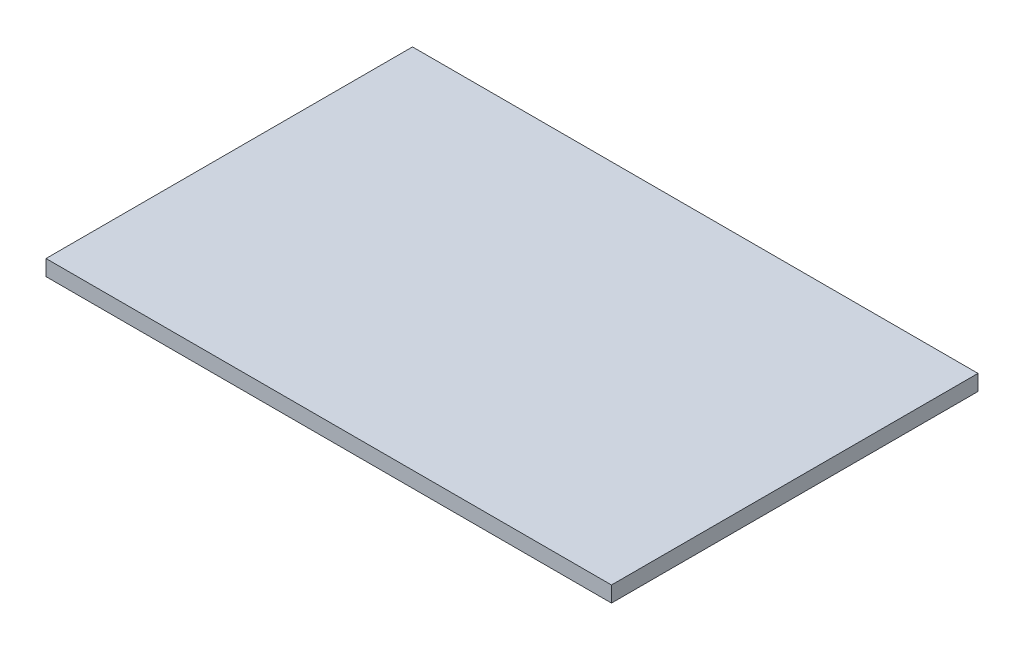
ISO-10303-21;
HEADER;
FILE_DESCRIPTION(('STEP AP214'),'2;1');
FILE_NAME('part.step','',(''),(''),'','','');
FILE_SCHEMA(('AUTOMOTIVE_DESIGN { 1 0 10303 214 1 1 1 1 }'));
ENDSEC;
DATA;
#1=APPLICATION_CONTEXT('core data for automotive mechanical design processes');
#2=APPLICATION_PROTOCOL_DEFINITION('international standard','automotive_design',2000,#1);
#3=PRODUCT_CONTEXT('',#1,'mechanical');
#4=PRODUCT('Part','Part','',(#3));
#5=PRODUCT_RELATED_PRODUCT_CATEGORY('part','',(#4));
#6=PRODUCT_DEFINITION_FORMATION('','',#4);
#7=PRODUCT_DEFINITION_CONTEXT('part definition',#1,'design');
#8=PRODUCT_DEFINITION('design','',#6,#7);
#9=PRODUCT_DEFINITION_SHAPE('','',#8);
#10=(LENGTH_UNIT() NAMED_UNIT(*) SI_UNIT(.MILLI.,.METRE.));
#11=(NAMED_UNIT(*) PLANE_ANGLE_UNIT() SI_UNIT($,.RADIAN.));
#12=(NAMED_UNIT(*) SI_UNIT($,.STERADIAN.) SOLID_ANGLE_UNIT());
#13=UNCERTAINTY_MEASURE_WITH_UNIT(LENGTH_MEASURE(1.E-05),#10,'distance_accuracy_value','');
#14=(GEOMETRIC_REPRESENTATION_CONTEXT(3) GLOBAL_UNCERTAINTY_ASSIGNED_CONTEXT((#13)) GLOBAL_UNIT_ASSIGNED_CONTEXT((#10,
#11,#12)) REPRESENTATION_CONTEXT('',''));
#15=CARTESIAN_POINT('',(0.,0.,0.));
#16=DIRECTION('',(0.,0.,1.));
#17=DIRECTION('',(1.,0.,0.));
#18=AXIS2_PLACEMENT_3D('',#15,#16,#17);
#19=CARTESIAN_POINT('',(54.,3.,35.));
#20=DIRECTION('',(-1.,0.,0.));
#21=DIRECTION('',(0.,0.,1.));
#22=AXIS2_PLACEMENT_3D('',#19,#20,#21);
#23=PLANE('',#22);
#24=DIRECTION('',(0.,0.,-1.));
#25=VECTOR('',#24,1.);
#26=CARTESIAN_POINT('',(54.,0.,35.));
#27=LINE('',#26,#25);
#28=CARTESIAN_POINT('',(54.,0.,35.));
#29=VERTEX_POINT('',#28);
#30=CARTESIAN_POINT('',(54.,0.,-35.));
#31=VERTEX_POINT('',#30);
#32=EDGE_CURVE('E96',#29,#31,#27,.T.);
#33=ORIENTED_EDGE('',*,*,#32,.T.);
#34=DIRECTION('',(0.,-1.,0.));
#35=VECTOR('',#34,1.);
#36=CARTESIAN_POINT('',(54.,3.,-35.));
#37=LINE('',#36,#35);
#38=CARTESIAN_POINT('',(54.,3.,-35.));
#39=VERTEX_POINT('',#38);
#40=EDGE_CURVE('E11',#39,#31,#37,.T.);
#41=ORIENTED_EDGE('',*,*,#40,.F.);
#42=DIRECTION('',(0.,0.,-1.));
#43=VECTOR('',#42,1.);
#44=CARTESIAN_POINT('',(54.,3.,35.));
#45=LINE('',#44,#43);
#46=CARTESIAN_POINT('',(54.,3.,35.));
#47=VERTEX_POINT('',#46);
#48=EDGE_CURVE('E84',#47,#39,#45,.T.);
#49=ORIENTED_EDGE('',*,*,#48,.F.);
#50=DIRECTION('',(0.,-1.,0.));
#51=VECTOR('',#50,1.);
#52=CARTESIAN_POINT('',(54.,3.,35.));
#53=LINE('',#52,#51);
#54=EDGE_CURVE('E92',#47,#29,#53,.T.);
#55=ORIENTED_EDGE('',*,*,#54,.T.);
#56=EDGE_LOOP('',(#33,#41,#49,#55));
#57=FACE_BOUND('',#56,.T.);
#58=ADVANCED_FACE('F33',(#57),#23,.F.);
#59=CARTESIAN_POINT('',(-54.,3.,-35.));
#60=DIRECTION('',(0.,0.,1.));
#61=DIRECTION('',(1.,0.,0.));
#62=AXIS2_PLACEMENT_3D('',#59,#60,#61);
#63=PLANE('',#62);
#64=DIRECTION('',(-1.,0.,0.));
#65=VECTOR('',#64,1.);
#66=CARTESIAN_POINT('',(-54.,0.,-35.));
#67=LINE('',#66,#65);
#68=CARTESIAN_POINT('',(-54.,0.,-35.));
#69=VERTEX_POINT('',#68);
#70=EDGE_CURVE('E88',#31,#69,#67,.T.);
#71=ORIENTED_EDGE('',*,*,#70,.T.);
#72=DIRECTION('',(0.,-1.,0.));
#73=VECTOR('',#72,1.);
#74=CARTESIAN_POINT('',(-54.,3.,-35.));
#75=LINE('',#74,#73);
#76=CARTESIAN_POINT('',(-54.,3.,-35.));
#77=VERTEX_POINT('',#76);
#78=EDGE_CURVE('E41',#77,#69,#75,.T.);
#79=ORIENTED_EDGE('',*,*,#78,.F.);
#80=DIRECTION('',(-1.,0.,0.));
#81=VECTOR('',#80,1.);
#82=CARTESIAN_POINT('',(-54.,3.,-35.));
#83=LINE('',#82,#81);
#84=EDGE_CURVE('E79',#39,#77,#83,.T.);
#85=ORIENTED_EDGE('',*,*,#84,.F.);
#86=ORIENTED_EDGE('',*,*,#40,.T.);
#87=EDGE_LOOP('',(#71,#79,#85,#86));
#88=FACE_BOUND('',#87,.T.);
#89=ADVANCED_FACE('F87',(#88),#63,.F.);
#90=CARTESIAN_POINT('',(-54.,3.,35.));
#91=DIRECTION('',(1.,0.,0.));
#92=DIRECTION('',(0.,0.,-1.));
#93=AXIS2_PLACEMENT_3D('',#90,#91,#92);
#94=PLANE('',#93);
#95=DIRECTION('',(0.,0.,1.));
#96=VECTOR('',#95,1.);
#97=CARTESIAN_POINT('',(-54.,0.,35.));
#98=LINE('',#97,#96);
#99=CARTESIAN_POINT('',(-54.,0.,35.));
#100=VERTEX_POINT('',#99);
#101=EDGE_CURVE('E66',#69,#100,#98,.T.);
#102=ORIENTED_EDGE('',*,*,#101,.T.);
#103=DIRECTION('',(0.,-1.,0.));
#104=VECTOR('',#103,1.);
#105=CARTESIAN_POINT('',(-54.,3.,35.));
#106=LINE('',#105,#104);
#107=CARTESIAN_POINT('',(-54.,3.,35.));
#108=VERTEX_POINT('',#107);
#109=EDGE_CURVE('E89',#108,#100,#106,.T.);
#110=ORIENTED_EDGE('',*,*,#109,.F.);
#111=DIRECTION('',(0.,0.,1.));
#112=VECTOR('',#111,1.);
#113=CARTESIAN_POINT('',(-54.,3.,35.));
#114=LINE('',#113,#112);
#115=EDGE_CURVE('E82',#77,#108,#114,.T.);
#116=ORIENTED_EDGE('',*,*,#115,.F.);
#117=ORIENTED_EDGE('',*,*,#78,.T.);
#118=EDGE_LOOP('',(#102,#110,#116,#117));
#119=FACE_BOUND('',#118,.T.);
#120=ADVANCED_FACE('F90',(#119),#94,.F.);
#121=CARTESIAN_POINT('',(-54.,3.,35.));
#122=DIRECTION('',(0.,0.,-1.));
#123=DIRECTION('',(-1.,0.,0.));
#124=AXIS2_PLACEMENT_3D('',#121,#122,#123);
#125=PLANE('',#124);
#126=DIRECTION('',(1.,0.,0.));
#127=VECTOR('',#126,1.);
#128=CARTESIAN_POINT('',(-54.,0.,35.));
#129=LINE('',#128,#127);
#130=EDGE_CURVE('E72',#100,#29,#129,.T.);
#131=ORIENTED_EDGE('',*,*,#130,.T.);
#132=ORIENTED_EDGE('',*,*,#54,.F.);
#133=DIRECTION('',(1.,0.,0.));
#134=VECTOR('',#133,1.);
#135=CARTESIAN_POINT('',(-54.,3.,35.));
#136=LINE('',#135,#134);
#137=EDGE_CURVE('E49',#108,#47,#136,.T.);
#138=ORIENTED_EDGE('',*,*,#137,.F.);
#139=ORIENTED_EDGE('',*,*,#109,.T.);
#140=EDGE_LOOP('',(#131,#132,#138,#139));
#141=FACE_BOUND('',#140,.T.);
#142=ADVANCED_FACE('F103',(#141),#125,.F.);
#143=CARTESIAN_POINT('',(0.,3.,0.));
#144=DIRECTION('',(0.,-1.,0.));
#145=DIRECTION('',(0.,0.,-1.));
#146=AXIS2_PLACEMENT_3D('',#143,#144,#145);
#147=PLANE('',#146);
#148=ORIENTED_EDGE('',*,*,#48,.T.);
#149=ORIENTED_EDGE('',*,*,#84,.T.);
#150=ORIENTED_EDGE('',*,*,#115,.T.);
#151=ORIENTED_EDGE('',*,*,#137,.T.);
#152=EDGE_LOOP('',(#148,#149,#150,#151));
#153=FACE_BOUND('',#152,.T.);
#154=ADVANCED_FACE('F80',(#153),#147,.F.);
#155=CARTESIAN_POINT('',(0.,0.,0.));
#156=DIRECTION('',(0.,-1.,0.));
#157=DIRECTION('',(0.,0.,-1.));
#158=AXIS2_PLACEMENT_3D('',#155,#156,#157);
#159=PLANE('',#158);
#160=ORIENTED_EDGE('',*,*,#32,.F.);
#161=ORIENTED_EDGE('',*,*,#130,.F.);
#162=ORIENTED_EDGE('',*,*,#101,.F.);
#163=ORIENTED_EDGE('',*,*,#70,.F.);
#164=EDGE_LOOP('',(#160,#161,#162,#163));
#165=FACE_BOUND('',#164,.T.);
#166=ADVANCED_FACE('F106',(#165),#159,.T.);
#167=CLOSED_SHELL('',(#58,#89,#120,#142,#154,#166));
#168=MANIFOLD_SOLID_BREP('B2',#167);
#169=ADVANCED_BREP_SHAPE_REPRESENTATION('',(#18,#168),#14);
#170=SHAPE_DEFINITION_REPRESENTATION(#9,#169);
ENDSEC;
END-ISO-10303-21;
